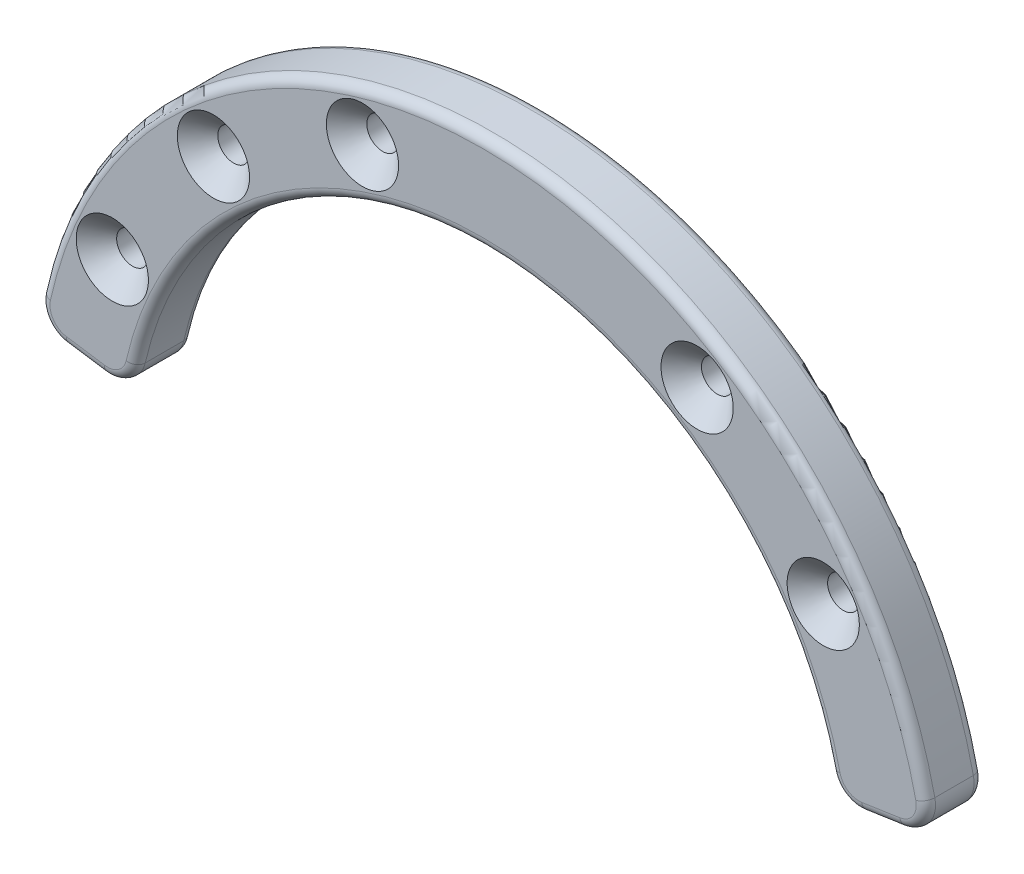
ISO-10303-21;
HEADER;
FILE_DESCRIPTION(('STEP AP214'),'2;1');
FILE_NAME('part.step','',(''),(''),'','','');
FILE_SCHEMA(('AUTOMOTIVE_DESIGN { 1 0 10303 214 1 1 1 1 }'));
ENDSEC;
DATA;
#1=APPLICATION_CONTEXT('core data for automotive mechanical design processes');
#2=APPLICATION_PROTOCOL_DEFINITION('international standard','automotive_design',2000,#1);
#3=PRODUCT_CONTEXT('',#1,'mechanical');
#4=PRODUCT('Part','Part','',(#3));
#5=PRODUCT_RELATED_PRODUCT_CATEGORY('part','',(#4));
#6=PRODUCT_DEFINITION_FORMATION('','',#4);
#7=PRODUCT_DEFINITION_CONTEXT('part definition',#1,'design');
#8=PRODUCT_DEFINITION('design','',#6,#7);
#9=PRODUCT_DEFINITION_SHAPE('','',#8);
#10=(LENGTH_UNIT() NAMED_UNIT(*) SI_UNIT(.MILLI.,.METRE.));
#11=(NAMED_UNIT(*) PLANE_ANGLE_UNIT() SI_UNIT($,.RADIAN.));
#12=(NAMED_UNIT(*) SI_UNIT($,.STERADIAN.) SOLID_ANGLE_UNIT());
#13=UNCERTAINTY_MEASURE_WITH_UNIT(LENGTH_MEASURE(1.E-05),#10,'distance_accuracy_value','');
#14=(GEOMETRIC_REPRESENTATION_CONTEXT(3) GLOBAL_UNCERTAINTY_ASSIGNED_CONTEXT((#13)) GLOBAL_UNIT_ASSIGNED_CONTEXT((#10,
#11,#12)) REPRESENTATION_CONTEXT('',''));
#15=CARTESIAN_POINT('',(0.,0.,0.));
#16=DIRECTION('',(0.,0.,1.));
#17=DIRECTION('',(1.,0.,0.));
#18=AXIS2_PLACEMENT_3D('',#15,#16,#17);
#19=CARTESIAN_POINT('',(0.,0.,6.));
#20=DIRECTION('',(0.,0.,-1.));
#21=DIRECTION('',(-1.,0.,0.));
#22=AXIS2_PLACEMENT_3D('',#19,#20,#21);
#23=CYLINDRICAL_SURFACE('',#22,47.);
#24=DIRECTION('',(0.,0.,-1.));
#25=VECTOR('',#24,1.);
#26=CARTESIAN_POINT('',(45.9019118426138,10.1002222348277,6.));
#27=LINE('',#26,#25);
#28=CARTESIAN_POINT('',(45.9019118426138,10.1002222348277,5.));
#29=VERTEX_POINT('',#28);
#30=CARTESIAN_POINT('',(45.9019118426138,10.1002222348277,1.));
#31=VERTEX_POINT('',#30);
#32=EDGE_CURVE('E353',#29,#31,#27,.T.);
#33=ORIENTED_EDGE('',*,*,#32,.T.);
#34=CARTESIAN_POINT('',(0.,0.,1.));
#35=DIRECTION('',(0.,0.,1.));
#36=DIRECTION('',(1.,0.,0.));
#37=AXIS2_PLACEMENT_3D('',#34,#35,#36);
#38=CIRCLE('',#37,47.);
#39=CARTESIAN_POINT('',(-45.9019118426138,10.1002222348277,1.));
#40=VERTEX_POINT('',#39);
#41=EDGE_CURVE('E237',#31,#40,#38,.T.);
#42=ORIENTED_EDGE('',*,*,#41,.T.);
#43=DIRECTION('',(0.,0.,-1.));
#44=VECTOR('',#43,1.);
#45=CARTESIAN_POINT('',(-45.9019118426138,10.1002222348277,6.));
#46=LINE('',#45,#44);
#47=CARTESIAN_POINT('',(-45.9019118426138,10.1002222348277,5.));
#48=VERTEX_POINT('',#47);
#49=EDGE_CURVE('E381',#40,#48,#46,.F.);
#50=ORIENTED_EDGE('',*,*,#49,.T.);
#51=CARTESIAN_POINT('',(0.,0.,5.));
#52=DIRECTION('',(0.,0.,1.));
#53=DIRECTION('',(1.,0.,0.));
#54=AXIS2_PLACEMENT_3D('',#51,#52,#53);
#55=CIRCLE('',#54,47.);
#56=EDGE_CURVE('E234',#48,#29,#55,.F.);
#57=ORIENTED_EDGE('',*,*,#56,.T.);
#58=EDGE_LOOP('',(#33,#42,#50,#57));
#59=FACE_BOUND('',#58,.T.);
#60=ADVANCED_FACE('F42',(#59),#23,.T.);
#61=CARTESIAN_POINT('',(-36.5935869443909,5.46894821179548,6.));
#62=DIRECTION('',(0.147809411129608,0.989015863361917,0.));
#63=DIRECTION('',(-0.989015863361917,0.147809411129608,0.));
#64=AXIS2_PLACEMENT_3D('',#61,#62,#63);
#65=PLANE('',#64);
#66=DIRECTION('',(0.,0.,-1.));
#67=VECTOR('',#66,1.);
#68=CARTESIAN_POINT('',(-43.4154308094528,6.48847960847636,6.));
#69=LINE('',#68,#67);
#70=CARTESIAN_POINT('',(-43.4154308094528,6.48847960847636,5.));
#71=VERTEX_POINT('',#70);
#72=CARTESIAN_POINT('',(-43.4154308094528,6.48847960847636,1.));
#73=VERTEX_POINT('',#72);
#74=EDGE_CURVE('E186',#71,#73,#69,.T.);
#75=ORIENTED_EDGE('',*,*,#74,.T.);
#76=DIRECTION('',(0.989015863361917,-0.147809411129608,0.));
#77=VECTOR('',#76,1.);
#78=CARTESIAN_POINT('',(-36.5935869443909,5.46894821179548,1.));
#79=LINE('',#78,#77);
#80=CARTESIAN_POINT('',(-39.4492133428361,5.8957244365221,1.));
#81=VERTEX_POINT('',#80);
#82=EDGE_CURVE('E225',#73,#81,#79,.T.);
#83=ORIENTED_EDGE('',*,*,#82,.T.);
#84=DIRECTION('',(0.,0.,-1.));
#85=VECTOR('',#84,1.);
#86=CARTESIAN_POINT('',(-39.4492133428361,5.8957244365221,6.));
#87=LINE('',#86,#85);
#88=CARTESIAN_POINT('',(-39.4492133428361,5.8957244365221,5.));
#89=VERTEX_POINT('',#88);
#90=EDGE_CURVE('E191',#81,#89,#87,.F.);
#91=ORIENTED_EDGE('',*,*,#90,.T.);
#92=DIRECTION('',(0.989015863361917,-0.147809411129608,0.));
#93=VECTOR('',#92,1.);
#94=CARTESIAN_POINT('',(-43.4154308094528,6.48847960847636,5.));
#95=LINE('',#94,#93);
#96=EDGE_CURVE('E222',#89,#71,#95,.F.);
#97=ORIENTED_EDGE('',*,*,#96,.T.);
#98=EDGE_LOOP('',(#75,#83,#91,#97));
#99=FACE_BOUND('',#98,.T.);
#100=ADVANCED_FACE('F459',(#99),#65,.F.);
#101=CARTESIAN_POINT('',(0.,0.,6.));
#102=DIRECTION('',(0.,0.,-1.));
#103=DIRECTION('',(-1.,0.,0.));
#104=AXIS2_PLACEMENT_3D('',#101,#102,#103);
#105=CYLINDRICAL_SURFACE('',#104,37.);
#106=DIRECTION('',(0.,0.,-1.));
#107=VECTOR('',#106,1.);
#108=CARTESIAN_POINT('',(-36.0803512262387,8.19806412461226,6.));
#109=LINE('',#108,#107);
#110=CARTESIAN_POINT('',(-36.0803512262387,8.19806412461226,5.));
#111=VERTEX_POINT('',#110);
#112=CARTESIAN_POINT('',(-36.0803512262387,8.19806412461226,1.));
#113=VERTEX_POINT('',#112);
#114=EDGE_CURVE('E366',#111,#113,#109,.T.);
#115=ORIENTED_EDGE('',*,*,#114,.T.);
#116=CARTESIAN_POINT('',(0.,0.,1.));
#117=DIRECTION('',(0.,0.,1.));
#118=DIRECTION('',(1.,0.,0.));
#119=AXIS2_PLACEMENT_3D('',#116,#117,#118);
#120=CIRCLE('',#119,37.);
#121=CARTESIAN_POINT('',(36.0803512262387,8.19806412461226,1.));
#122=VERTEX_POINT('',#121);
#123=EDGE_CURVE('E11',#113,#122,#120,.F.);
#124=ORIENTED_EDGE('',*,*,#123,.T.);
#125=DIRECTION('',(0.,0.,-1.));
#126=VECTOR('',#125,1.);
#127=CARTESIAN_POINT('',(36.0803512262387,8.19806412461226,6.));
#128=LINE('',#127,#126);
#129=CARTESIAN_POINT('',(36.0803512262387,8.19806412461226,5.));
#130=VERTEX_POINT('',#129);
#131=EDGE_CURVE('E377',#122,#130,#128,.F.);
#132=ORIENTED_EDGE('',*,*,#131,.T.);
#133=CARTESIAN_POINT('',(0.,0.,5.));
#134=DIRECTION('',(0.,0.,1.));
#135=DIRECTION('',(1.,0.,0.));
#136=AXIS2_PLACEMENT_3D('',#133,#134,#135);
#137=CIRCLE('',#136,37.);
#138=EDGE_CURVE('E52',#130,#111,#137,.T.);
#139=ORIENTED_EDGE('',*,*,#138,.T.);
#140=EDGE_LOOP('',(#115,#124,#132,#139));
#141=FACE_BOUND('',#140,.T.);
#142=ADVANCED_FACE('F465',(#141),#105,.F.);
#143=CARTESIAN_POINT('',(36.5935869443909,5.46894821179548,6.));
#144=DIRECTION('',(-0.147809411129608,0.989015863361917,0.));
#145=DIRECTION('',(-0.989015863361917,-0.147809411129608,0.));
#146=AXIS2_PLACEMENT_3D('',#143,#144,#145);
#147=PLANE('',#146);
#148=DIRECTION('',(0.,0.,-1.));
#149=VECTOR('',#148,1.);
#150=CARTESIAN_POINT('',(39.4492133428361,5.8957244365221,6.));
#151=LINE('',#150,#149);
#152=CARTESIAN_POINT('',(39.4492133428361,5.8957244365221,5.));
#153=VERTEX_POINT('',#152);
#154=CARTESIAN_POINT('',(39.4492133428361,5.8957244365221,1.));
#155=VERTEX_POINT('',#154);
#156=EDGE_CURVE('E360',#153,#155,#151,.T.);
#157=ORIENTED_EDGE('',*,*,#156,.T.);
#158=DIRECTION('',(0.989015863361917,0.147809411129608,0.));
#159=VECTOR('',#158,1.);
#160=CARTESIAN_POINT('',(36.5935869443909,5.46894821179548,1.));
#161=LINE('',#160,#159);
#162=CARTESIAN_POINT('',(43.4154308094528,6.48847960847636,1.));
#163=VERTEX_POINT('',#162);
#164=EDGE_CURVE('E249',#155,#163,#161,.T.);
#165=ORIENTED_EDGE('',*,*,#164,.T.);
#166=DIRECTION('',(0.,0.,-1.));
#167=VECTOR('',#166,1.);
#168=CARTESIAN_POINT('',(43.4154308094528,6.48847960847636,6.));
#169=LINE('',#168,#167);
#170=CARTESIAN_POINT('',(43.4154308094528,6.48847960847636,5.));
#171=VERTEX_POINT('',#170);
#172=EDGE_CURVE('E350',#163,#171,#169,.F.);
#173=ORIENTED_EDGE('',*,*,#172,.T.);
#174=DIRECTION('',(0.989015863361917,0.147809411129608,0.));
#175=VECTOR('',#174,1.);
#176=CARTESIAN_POINT('',(39.4492133428361,5.8957244365221,5.));
#177=LINE('',#176,#175);
#178=EDGE_CURVE('E246',#171,#153,#177,.F.);
#179=ORIENTED_EDGE('',*,*,#178,.T.);
#180=EDGE_LOOP('',(#157,#165,#173,#179));
#181=FACE_BOUND('',#180,.T.);
#182=ADVANCED_FACE('F356',(#181),#147,.F.);
#183=CARTESIAN_POINT('',(0.,0.,6.));
#184=DIRECTION('',(0.,0.,1.));
#185=DIRECTION('',(1.,0.,0.));
#186=AXIS2_PLACEMENT_3D('',#183,#184,#185);
#187=PLANE('',#186);
#188=DIRECTION('',(0.989015863361917,-0.147809411129608,0.));
#189=VECTOR('',#188,1.);
#190=CARTESIAN_POINT('',(-39.3014039317065,6.88474029988402,6.));
#191=LINE('',#190,#189);
#192=CARTESIAN_POINT('',(-43.2676213983232,7.47749547183828,6.));
#193=VERTEX_POINT('',#192);
#194=CARTESIAN_POINT('',(-39.3014039317065,6.88474029988402,6.));
#195=VERTEX_POINT('',#194);
#196=EDGE_CURVE('E60',#193,#195,#191,.T.);
#197=ORIENTED_EDGE('',*,*,#196,.T.);
#198=CARTESIAN_POINT('',(-39.0057851094473,8.86277202660785,6.));
#199=DIRECTION('',(0.,0.,1.));
#200=DIRECTION('',(1.,0.,0.));
#201=AXIS2_PLACEMENT_3D('',#198,#199,#200);
#202=CIRCLE('',#201,2.);
#203=CARTESIAN_POINT('',(-37.0554958539749,8.41963342527746,6.));
#204=VERTEX_POINT('',#203);
#205=EDGE_CURVE('E276',#195,#204,#202,.T.);
#206=ORIENTED_EDGE('',*,*,#205,.T.);
#207=CARTESIAN_POINT('',(0.,0.,6.));
#208=DIRECTION('',(0.,0.,1.));
#209=DIRECTION('',(1.,0.,0.));
#210=AXIS2_PLACEMENT_3D('',#207,#208,#209);
#211=CIRCLE('',#210,38.);
#212=CARTESIAN_POINT('',(37.0554958539749,8.41963342527746,6.));
#213=VERTEX_POINT('',#212);
#214=EDGE_CURVE('E257',#204,#213,#211,.F.);
#215=ORIENTED_EDGE('',*,*,#214,.T.);
#216=CARTESIAN_POINT('',(39.0057851094473,8.86277202660785,6.));
#217=DIRECTION('',(0.,0.,1.));
#218=DIRECTION('',(1.,0.,0.));
#219=AXIS2_PLACEMENT_3D('',#216,#217,#218);
#220=CIRCLE('',#219,2.);
#221=CARTESIAN_POINT('',(39.3014039317065,6.88474029988402,6.));
#222=VERTEX_POINT('',#221);
#223=EDGE_CURVE('E260',#213,#222,#220,.T.);
#224=ORIENTED_EDGE('',*,*,#223,.T.);
#225=DIRECTION('',(0.989015863361917,0.147809411129608,0.));
#226=VECTOR('',#225,1.);
#227=CARTESIAN_POINT('',(43.2676213983232,7.47749547183828,6.));
#228=LINE('',#227,#226);
#229=CARTESIAN_POINT('',(43.2676213983232,7.47749547183828,6.));
#230=VERTEX_POINT('',#229);
#231=EDGE_CURVE('E263',#222,#230,#228,.T.);
#232=ORIENTED_EDGE('',*,*,#231,.T.);
#233=CARTESIAN_POINT('',(42.972002576064,9.45552719856211,6.));
#234=DIRECTION('',(0.,0.,1.));
#235=DIRECTION('',(1.,0.,0.));
#236=AXIS2_PLACEMENT_3D('',#233,#234,#235);
#237=CIRCLE('',#236,2.);
#238=CARTESIAN_POINT('',(44.9252754204305,9.88532388940585,6.));
#239=VERTEX_POINT('',#238);
#240=EDGE_CURVE('E266',#230,#239,#237,.T.);
#241=ORIENTED_EDGE('',*,*,#240,.T.);
#242=CARTESIAN_POINT('',(0.,0.,6.));
#243=DIRECTION('',(0.,0.,1.));
#244=DIRECTION('',(1.,0.,0.));
#245=AXIS2_PLACEMENT_3D('',#242,#243,#244);
#246=CIRCLE('',#245,46.);
#247=CARTESIAN_POINT('',(-44.9252754204306,9.88532388940585,6.));
#248=VERTEX_POINT('',#247);
#249=EDGE_CURVE('E269',#239,#248,#246,.T.);
#250=ORIENTED_EDGE('',*,*,#249,.T.);
#251=CARTESIAN_POINT('',(-42.972002576064,9.45552719856211,6.));
#252=DIRECTION('',(0.,0.,1.));
#253=DIRECTION('',(1.,0.,0.));
#254=AXIS2_PLACEMENT_3D('',#251,#252,#253);
#255=CIRCLE('',#254,2.);
#256=EDGE_CURVE('E65',#248,#193,#255,.T.);
#257=ORIENTED_EDGE('',*,*,#256,.T.);
#258=EDGE_LOOP('',(#197,#206,#215,#224,#232,#241,#250,#257));
#259=FACE_BOUND('',#258,.T.);
#260=CARTESIAN_POINT('',(-38.4973377729861,16.7906202083129,6.));
#261=DIRECTION('',(0.,0.,1.));
#262=DIRECTION('',(1.,0.,0.));
#263=AXIS2_PLACEMENT_3D('',#260,#261,#262);
#264=CIRCLE('',#263,3.75);
#265=CARTESIAN_POINT('',(-34.7473377729861,16.7906202083129,6.));
#266=VERTEX_POINT('',#265);
#267=EDGE_CURVE('E303',#266,#266,#264,.T.);
#268=ORIENTED_EDGE('',*,*,#267,.F.);
#269=EDGE_LOOP('',(#268));
#270=FACE_BOUND('',#269,.T.);
#271=CARTESIAN_POINT('',(-27.9991090041942,31.3056560635971,6.));
#272=DIRECTION('',(0.,0.,1.));
#273=DIRECTION('',(1.,0.,0.));
#274=AXIS2_PLACEMENT_3D('',#271,#272,#273);
#275=CIRCLE('',#274,3.75);
#276=CARTESIAN_POINT('',(-24.2491090041942,31.3056560635971,6.));
#277=VERTEX_POINT('',#276);
#278=EDGE_CURVE('E414',#277,#277,#275,.T.);
#279=ORIENTED_EDGE('',*,*,#278,.F.);
#280=EDGE_LOOP('',(#279));
#281=FACE_BOUND('',#280,.T.);
#282=CARTESIAN_POINT('',(-12.5268724550049,40.0883668064767,6.));
#283=DIRECTION('',(0.,0.,1.));
#284=DIRECTION('',(1.,0.,0.));
#285=AXIS2_PLACEMENT_3D('',#282,#283,#284);
#286=CIRCLE('',#285,3.75);
#287=CARTESIAN_POINT('',(-8.77687245500494,40.0883668064767,6.));
#288=VERTEX_POINT('',#287);
#289=EDGE_CURVE('E404',#288,#288,#286,.T.);
#290=ORIENTED_EDGE('',*,*,#289,.F.);
#291=EDGE_LOOP('',(#290));
#292=FACE_BOUND('',#291,.T.);
#293=CARTESIAN_POINT('',(22.2221629793455,35.6390019624954,6.));
#294=DIRECTION('',(0.,0.,1.));
#295=DIRECTION('',(1.,0.,0.));
#296=AXIS2_PLACEMENT_3D('',#293,#294,#295);
#297=CIRCLE('',#296,3.75);
#298=CARTESIAN_POINT('',(25.9721629793455,35.6390019624954,6.));
#299=VERTEX_POINT('',#298);
#300=EDGE_CURVE('E399',#299,#299,#297,.T.);
#301=ORIENTED_EDGE('',*,*,#300,.F.);
#302=EDGE_LOOP('',(#301));
#303=FACE_BOUND('',#302,.T.);
#304=CARTESIAN_POINT('',(35.3163481039539,22.7309884807105,6.));
#305=DIRECTION('',(0.,0.,1.));
#306=DIRECTION('',(1.,0.,0.));
#307=AXIS2_PLACEMENT_3D('',#304,#305,#306);
#308=CIRCLE('',#307,3.75);
#309=CARTESIAN_POINT('',(39.0663481039539,22.7309884807105,6.));
#310=VERTEX_POINT('',#309);
#311=EDGE_CURVE('E394',#310,#310,#308,.T.);
#312=ORIENTED_EDGE('',*,*,#311,.F.);
#313=EDGE_LOOP('',(#312));
#314=FACE_BOUND('',#313,.T.);
#315=ADVANCED_FACE('F672',(#259,#270,#281,#292,#303,#314),#187,.T.);
#316=CARTESIAN_POINT('',(0.,0.,0.));
#317=DIRECTION('',(0.,0.,1.));
#318=DIRECTION('',(1.,0.,0.));
#319=AXIS2_PLACEMENT_3D('',#316,#317,#318);
#320=PLANE('',#319);
#321=CARTESIAN_POINT('',(0.,0.,0.));
#322=DIRECTION('',(0.,0.,1.));
#323=DIRECTION('',(1.,0.,0.));
#324=AXIS2_PLACEMENT_3D('',#321,#322,#323);
#325=CIRCLE('',#324,38.);
#326=CARTESIAN_POINT('',(37.0554958539749,8.41963342527746,0.));
#327=VERTEX_POINT('',#326);
#328=CARTESIAN_POINT('',(-37.0554958539749,8.41963342527746,0.));
#329=VERTEX_POINT('',#328);
#330=EDGE_CURVE('E162',#327,#329,#325,.T.);
#331=ORIENTED_EDGE('',*,*,#330,.T.);
#332=CARTESIAN_POINT('',(-39.0057851094473,8.86277202660785,0.));
#333=DIRECTION('',(0.,0.,1.));
#334=DIRECTION('',(1.,0.,0.));
#335=AXIS2_PLACEMENT_3D('',#332,#333,#334);
#336=CIRCLE('',#335,2.);
#337=CARTESIAN_POINT('',(-39.3014039317065,6.88474029988402,0.));
#338=VERTEX_POINT('',#337);
#339=EDGE_CURVE('E211',#329,#338,#336,.F.);
#340=ORIENTED_EDGE('',*,*,#339,.T.);
#341=DIRECTION('',(0.989015863361917,-0.147809411129608,0.));
#342=VECTOR('',#341,1.);
#343=CARTESIAN_POINT('',(0.147809411129607,0.989015863361916,0.));
#344=LINE('',#343,#342);
#345=CARTESIAN_POINT('',(-43.2676213983232,7.47749547183828,0.));
#346=VERTEX_POINT('',#345);
#347=EDGE_CURVE('E208',#338,#346,#344,.F.);
#348=ORIENTED_EDGE('',*,*,#347,.T.);
#349=CARTESIAN_POINT('',(-42.972002576064,9.45552719856211,0.));
#350=DIRECTION('',(0.,0.,1.));
#351=DIRECTION('',(1.,0.,0.));
#352=AXIS2_PLACEMENT_3D('',#349,#350,#351);
#353=CIRCLE('',#352,2.);
#354=CARTESIAN_POINT('',(-44.9252754204306,9.88532388940585,0.));
#355=VERTEX_POINT('',#354);
#356=EDGE_CURVE('E205',#346,#355,#353,.F.);
#357=ORIENTED_EDGE('',*,*,#356,.T.);
#358=CARTESIAN_POINT('',(0.,0.,0.));
#359=DIRECTION('',(0.,0.,1.));
#360=DIRECTION('',(1.,0.,0.));
#361=AXIS2_PLACEMENT_3D('',#358,#359,#360);
#362=CIRCLE('',#361,46.);
#363=CARTESIAN_POINT('',(44.9252754204305,9.88532388940585,0.));
#364=VERTEX_POINT('',#363);
#365=EDGE_CURVE('E202',#355,#364,#362,.F.);
#366=ORIENTED_EDGE('',*,*,#365,.T.);
#367=CARTESIAN_POINT('',(42.972002576064,9.45552719856211,0.));
#368=DIRECTION('',(0.,0.,1.));
#369=DIRECTION('',(1.,0.,0.));
#370=AXIS2_PLACEMENT_3D('',#367,#368,#369);
#371=CIRCLE('',#370,2.);
#372=CARTESIAN_POINT('',(43.2676213983232,7.47749547183828,0.));
#373=VERTEX_POINT('',#372);
#374=EDGE_CURVE('E199',#364,#373,#371,.F.);
#375=ORIENTED_EDGE('',*,*,#374,.T.);
#376=DIRECTION('',(0.989015863361917,0.147809411129608,0.));
#377=VECTOR('',#376,1.);
#378=CARTESIAN_POINT('',(-0.147809411129607,0.989015863361915,0.));
#379=LINE('',#378,#377);
#380=CARTESIAN_POINT('',(39.3014039317065,6.88474029988402,0.));
#381=VERTEX_POINT('',#380);
#382=EDGE_CURVE('E165',#373,#381,#379,.F.);
#383=ORIENTED_EDGE('',*,*,#382,.T.);
#384=CARTESIAN_POINT('',(39.0057851094473,8.86277202660785,0.));
#385=DIRECTION('',(0.,0.,1.));
#386=DIRECTION('',(1.,0.,0.));
#387=AXIS2_PLACEMENT_3D('',#384,#385,#386);
#388=CIRCLE('',#387,2.);
#389=EDGE_CURVE('E156',#381,#327,#388,.F.);
#390=ORIENTED_EDGE('',*,*,#389,.T.);
#391=EDGE_LOOP('',(#331,#340,#348,#357,#366,#375,#383,#390));
#392=FACE_BOUND('',#391,.T.);
#393=CARTESIAN_POINT('',(-38.4973377729861,16.7906202083129,0.));
#394=DIRECTION('',(0.,0.,1.));
#395=DIRECTION('',(1.,0.,0.));
#396=AXIS2_PLACEMENT_3D('',#393,#394,#395);
#397=CIRCLE('',#396,1.65);
#398=CARTESIAN_POINT('',(-36.8473377729861,16.7906202083129,0.));
#399=VERTEX_POINT('',#398);
#400=EDGE_CURVE('E194',#399,#399,#397,.T.);
#401=ORIENTED_EDGE('',*,*,#400,.T.);
#402=EDGE_LOOP('',(#401));
#403=FACE_BOUND('',#402,.T.);
#404=CARTESIAN_POINT('',(-27.9991090041942,31.3056560635971,0.));
#405=DIRECTION('',(0.,0.,1.));
#406=DIRECTION('',(1.,0.,0.));
#407=AXIS2_PLACEMENT_3D('',#404,#405,#406);
#408=CIRCLE('',#407,1.65);
#409=CARTESIAN_POINT('',(-26.3491090041942,31.3056560635971,0.));
#410=VERTEX_POINT('',#409);
#411=EDGE_CURVE('E401',#410,#410,#408,.T.);
#412=ORIENTED_EDGE('',*,*,#411,.T.);
#413=EDGE_LOOP('',(#412));
#414=FACE_BOUND('',#413,.T.);
#415=CARTESIAN_POINT('',(-12.5268724550049,40.0883668064767,0.));
#416=DIRECTION('',(0.,0.,1.));
#417=DIRECTION('',(1.,0.,0.));
#418=AXIS2_PLACEMENT_3D('',#415,#416,#417);
#419=CIRCLE('',#418,1.65);
#420=CARTESIAN_POINT('',(-10.8768724550049,40.0883668064767,0.));
#421=VERTEX_POINT('',#420);
#422=EDGE_CURVE('E396',#421,#421,#419,.T.);
#423=ORIENTED_EDGE('',*,*,#422,.T.);
#424=EDGE_LOOP('',(#423));
#425=FACE_BOUND('',#424,.T.);
#426=CARTESIAN_POINT('',(22.2221629793455,35.6390019624954,0.));
#427=DIRECTION('',(0.,0.,1.));
#428=DIRECTION('',(1.,0.,0.));
#429=AXIS2_PLACEMENT_3D('',#426,#427,#428);
#430=CIRCLE('',#429,1.65);
#431=CARTESIAN_POINT('',(23.8721629793455,35.6390019624954,0.));
#432=VERTEX_POINT('',#431);
#433=EDGE_CURVE('E390',#432,#432,#430,.T.);
#434=ORIENTED_EDGE('',*,*,#433,.T.);
#435=EDGE_LOOP('',(#434));
#436=FACE_BOUND('',#435,.T.);
#437=CARTESIAN_POINT('',(35.3163481039539,22.7309884807105,0.));
#438=DIRECTION('',(0.,0.,1.));
#439=DIRECTION('',(1.,0.,0.));
#440=AXIS2_PLACEMENT_3D('',#437,#438,#439);
#441=CIRCLE('',#440,1.65);
#442=CARTESIAN_POINT('',(36.9663481039539,22.7309884807105,0.));
#443=VERTEX_POINT('',#442);
#444=EDGE_CURVE('E361',#443,#443,#441,.T.);
#445=ORIENTED_EDGE('',*,*,#444,.T.);
#446=EDGE_LOOP('',(#445));
#447=FACE_BOUND('',#446,.T.);
#448=ADVANCED_FACE('F158',(#392,#403,#414,#425,#436,#447),#320,.F.);
#449=CARTESIAN_POINT('',(39.0057851094473,8.86277202660785,6.));
#450=DIRECTION('',(0.,0.,-1.));
#451=DIRECTION('',(-1.,0.,0.));
#452=AXIS2_PLACEMENT_3D('',#449,#450,#451);
#453=CYLINDRICAL_SURFACE('',#452,3.);
#454=ORIENTED_EDGE('',*,*,#131,.F.);
#455=CARTESIAN_POINT('',(39.0057851094473,8.86277202660785,1.));
#456=DIRECTION('',(0.,0.,1.));
#457=DIRECTION('',(1.,0.,0.));
#458=AXIS2_PLACEMENT_3D('',#455,#456,#457);
#459=CIRCLE('',#458,3.);
#460=EDGE_CURVE('E175',#122,#155,#459,.T.);
#461=ORIENTED_EDGE('',*,*,#460,.T.);
#462=ORIENTED_EDGE('',*,*,#156,.F.);
#463=CARTESIAN_POINT('',(39.0057851094473,8.86277202660785,5.));
#464=DIRECTION('',(0.,0.,1.));
#465=DIRECTION('',(1.,0.,0.));
#466=AXIS2_PLACEMENT_3D('',#463,#464,#465);
#467=CIRCLE('',#466,3.);
#468=EDGE_CURVE('E252',#153,#130,#467,.F.);
#469=ORIENTED_EDGE('',*,*,#468,.T.);
#470=EDGE_LOOP('',(#454,#461,#462,#469));
#471=FACE_BOUND('',#470,.T.);
#472=ADVANCED_FACE('F470',(#471),#453,.T.);
#473=CARTESIAN_POINT('',(42.972002576064,9.45552719856211,6.));
#474=DIRECTION('',(0.,0.,-1.));
#475=DIRECTION('',(-1.,0.,0.));
#476=AXIS2_PLACEMENT_3D('',#473,#474,#475);
#477=CYLINDRICAL_SURFACE('',#476,3.);
#478=ORIENTED_EDGE('',*,*,#172,.F.);
#479=CARTESIAN_POINT('',(42.972002576064,9.45552719856211,1.));
#480=DIRECTION('',(0.,0.,1.));
#481=DIRECTION('',(1.,0.,0.));
#482=AXIS2_PLACEMENT_3D('',#479,#480,#481);
#483=CIRCLE('',#482,3.);
#484=EDGE_CURVE('E243',#163,#31,#483,.T.);
#485=ORIENTED_EDGE('',*,*,#484,.T.);
#486=ORIENTED_EDGE('',*,*,#32,.F.);
#487=CARTESIAN_POINT('',(42.972002576064,9.45552719856211,5.));
#488=DIRECTION('',(0.,0.,1.));
#489=DIRECTION('',(1.,0.,0.));
#490=AXIS2_PLACEMENT_3D('',#487,#488,#489);
#491=CIRCLE('',#490,3.);
#492=EDGE_CURVE('E240',#29,#171,#491,.F.);
#493=ORIENTED_EDGE('',*,*,#492,.T.);
#494=EDGE_LOOP('',(#478,#485,#486,#493));
#495=FACE_BOUND('',#494,.T.);
#496=ADVANCED_FACE('F349',(#495),#477,.T.);
#497=CARTESIAN_POINT('',(-42.972002576064,9.45552719856211,6.));
#498=DIRECTION('',(0.,0.,-1.));
#499=DIRECTION('',(-1.,0.,0.));
#500=AXIS2_PLACEMENT_3D('',#497,#498,#499);
#501=CYLINDRICAL_SURFACE('',#500,3.);
#502=ORIENTED_EDGE('',*,*,#49,.F.);
#503=CARTESIAN_POINT('',(-42.972002576064,9.45552719856211,1.));
#504=DIRECTION('',(0.,0.,1.));
#505=DIRECTION('',(1.,0.,0.));
#506=AXIS2_PLACEMENT_3D('',#503,#504,#505);
#507=CIRCLE('',#506,3.);
#508=EDGE_CURVE('E231',#40,#73,#507,.T.);
#509=ORIENTED_EDGE('',*,*,#508,.T.);
#510=ORIENTED_EDGE('',*,*,#74,.F.);
#511=CARTESIAN_POINT('',(-42.972002576064,9.45552719856211,5.));
#512=DIRECTION('',(0.,0.,1.));
#513=DIRECTION('',(1.,0.,0.));
#514=AXIS2_PLACEMENT_3D('',#511,#512,#513);
#515=CIRCLE('',#514,3.);
#516=EDGE_CURVE('E228',#71,#48,#515,.F.);
#517=ORIENTED_EDGE('',*,*,#516,.T.);
#518=EDGE_LOOP('',(#502,#509,#510,#517));
#519=FACE_BOUND('',#518,.T.);
#520=ADVANCED_FACE('F476',(#519),#501,.T.);
#521=CARTESIAN_POINT('',(-39.0057851094473,8.86277202660785,6.));
#522=DIRECTION('',(0.,0.,-1.));
#523=DIRECTION('',(-1.,0.,0.));
#524=AXIS2_PLACEMENT_3D('',#521,#522,#523);
#525=CYLINDRICAL_SURFACE('',#524,3.);
#526=ORIENTED_EDGE('',*,*,#90,.F.);
#527=CARTESIAN_POINT('',(-39.0057851094473,8.86277202660785,1.));
#528=DIRECTION('',(0.,0.,1.));
#529=DIRECTION('',(1.,0.,0.));
#530=AXIS2_PLACEMENT_3D('',#527,#528,#529);
#531=CIRCLE('',#530,3.);
#532=EDGE_CURVE('E218',#81,#113,#531,.T.);
#533=ORIENTED_EDGE('',*,*,#532,.T.);
#534=ORIENTED_EDGE('',*,*,#114,.F.);
#535=CARTESIAN_POINT('',(-39.0057851094473,8.86277202660785,5.));
#536=DIRECTION('',(0.,0.,1.));
#537=DIRECTION('',(1.,0.,0.));
#538=AXIS2_PLACEMENT_3D('',#535,#536,#537);
#539=CIRCLE('',#538,3.);
#540=EDGE_CURVE('E214',#111,#89,#539,.F.);
#541=ORIENTED_EDGE('',*,*,#540,.T.);
#542=EDGE_LOOP('',(#526,#533,#534,#541));
#543=FACE_BOUND('',#542,.T.);
#544=ADVANCED_FACE('F456',(#543),#525,.T.);
#545=CARTESIAN_POINT('',(35.3163481039539,22.7309884807105,6.));
#546=DIRECTION('',(0.,0.,1.));
#547=DIRECTION('',(1.,0.,0.));
#548=AXIS2_PLACEMENT_3D('',#545,#546,#547);
#549=CYLINDRICAL_SURFACE('',#548,1.65);
#550=CARTESIAN_POINT('',(35.3163481039539,22.7309884807105,3.9));
#551=DIRECTION('',(0.,0.,1.));
#552=DIRECTION('',(1.,0.,0.));
#553=AXIS2_PLACEMENT_3D('',#550,#551,#552);
#554=CIRCLE('',#553,1.65);
#555=CARTESIAN_POINT('',(36.9663481039539,22.7309884807105,3.9));
#556=VERTEX_POINT('',#555);
#557=EDGE_CURVE('E369',#556,#556,#554,.T.);
#558=ORIENTED_EDGE('',*,*,#557,.T.);
#559=EDGE_LOOP('',(#558));
#560=FACE_BOUND('',#559,.T.);
#561=ORIENTED_EDGE('',*,*,#444,.F.);
#562=EDGE_LOOP('',(#561));
#563=FACE_BOUND('',#562,.T.);
#564=ADVANCED_FACE('F442',(#560,#563),#549,.F.);
#565=CARTESIAN_POINT('',(35.3163481039539,22.7309884807105,6.));
#566=DIRECTION('',(0.,0.,1.));
#567=DIRECTION('',(1.,0.,0.));
#568=AXIS2_PLACEMENT_3D('',#565,#566,#567);
#569=CONICAL_SURFACE('',#568,3.75,0.785398163397449);
#570=ORIENTED_EDGE('',*,*,#557,.F.);
#571=EDGE_LOOP('',(#570));
#572=FACE_BOUND('',#571,.T.);
#573=ORIENTED_EDGE('',*,*,#311,.T.);
#574=EDGE_LOOP('',(#573));
#575=FACE_BOUND('',#574,.T.);
#576=ADVANCED_FACE('F445',(#572,#575),#569,.F.);
#577=CARTESIAN_POINT('',(22.2221629793455,35.6390019624954,6.));
#578=DIRECTION('',(0.,0.,1.));
#579=DIRECTION('',(1.,0.,0.));
#580=AXIS2_PLACEMENT_3D('',#577,#578,#579);
#581=CYLINDRICAL_SURFACE('',#580,1.65);
#582=CARTESIAN_POINT('',(22.2221629793455,35.6390019624954,3.9));
#583=DIRECTION('',(0.,0.,1.));
#584=DIRECTION('',(1.,0.,0.));
#585=AXIS2_PLACEMENT_3D('',#582,#583,#584);
#586=CIRCLE('',#585,1.65);
#587=CARTESIAN_POINT('',(23.8721629793455,35.6390019624954,3.9));
#588=VERTEX_POINT('',#587);
#589=EDGE_CURVE('E395',#588,#588,#586,.T.);
#590=ORIENTED_EDGE('',*,*,#589,.T.);
#591=EDGE_LOOP('',(#590));
#592=FACE_BOUND('',#591,.T.);
#593=ORIENTED_EDGE('',*,*,#433,.F.);
#594=EDGE_LOOP('',(#593));
#595=FACE_BOUND('',#594,.T.);
#596=ADVANCED_FACE('F447',(#592,#595),#581,.F.);
#597=CARTESIAN_POINT('',(22.2221629793455,35.6390019624954,6.));
#598=DIRECTION('',(0.,0.,1.));
#599=DIRECTION('',(1.,0.,0.));
#600=AXIS2_PLACEMENT_3D('',#597,#598,#599);
#601=CONICAL_SURFACE('',#600,3.75,0.785398163397448);
#602=ORIENTED_EDGE('',*,*,#589,.F.);
#603=EDGE_LOOP('',(#602));
#604=FACE_BOUND('',#603,.T.);
#605=ORIENTED_EDGE('',*,*,#300,.T.);
#606=EDGE_LOOP('',(#605));
#607=FACE_BOUND('',#606,.T.);
#608=ADVANCED_FACE('F453',(#604,#607),#601,.F.);
#609=CARTESIAN_POINT('',(-12.5268724550049,40.0883668064767,6.));
#610=DIRECTION('',(0.,0.,1.));
#611=DIRECTION('',(1.,0.,0.));
#612=AXIS2_PLACEMENT_3D('',#609,#610,#611);
#613=CYLINDRICAL_SURFACE('',#612,1.65);
#614=CARTESIAN_POINT('',(-12.5268724550049,40.0883668064767,3.9));
#615=DIRECTION('',(0.,0.,1.));
#616=DIRECTION('',(1.,0.,0.));
#617=AXIS2_PLACEMENT_3D('',#614,#615,#616);
#618=CIRCLE('',#617,1.65);
#619=CARTESIAN_POINT('',(-10.8768724550049,40.0883668064767,3.9));
#620=VERTEX_POINT('',#619);
#621=EDGE_CURVE('E400',#620,#620,#618,.T.);
#622=ORIENTED_EDGE('',*,*,#621,.T.);
#623=EDGE_LOOP('',(#622));
#624=FACE_BOUND('',#623,.T.);
#625=ORIENTED_EDGE('',*,*,#422,.F.);
#626=EDGE_LOOP('',(#625));
#627=FACE_BOUND('',#626,.T.);
#628=ADVANCED_FACE('F609',(#624,#627),#613,.F.);
#629=CARTESIAN_POINT('',(-12.5268724550049,40.0883668064767,6.));
#630=DIRECTION('',(0.,0.,1.));
#631=DIRECTION('',(1.,0.,0.));
#632=AXIS2_PLACEMENT_3D('',#629,#630,#631);
#633=CONICAL_SURFACE('',#632,3.75,0.785398163397448);
#634=ORIENTED_EDGE('',*,*,#621,.F.);
#635=EDGE_LOOP('',(#634));
#636=FACE_BOUND('',#635,.T.);
#637=ORIENTED_EDGE('',*,*,#289,.T.);
#638=EDGE_LOOP('',(#637));
#639=FACE_BOUND('',#638,.T.);
#640=ADVANCED_FACE('F602',(#636,#639),#633,.F.);
#641=CARTESIAN_POINT('',(-27.9991090041942,31.3056560635971,6.));
#642=DIRECTION('',(0.,0.,1.));
#643=DIRECTION('',(1.,0.,0.));
#644=AXIS2_PLACEMENT_3D('',#641,#642,#643);
#645=CYLINDRICAL_SURFACE('',#644,1.65);
#646=CARTESIAN_POINT('',(-27.9991090041942,31.3056560635971,3.9));
#647=DIRECTION('',(0.,0.,1.));
#648=DIRECTION('',(1.,0.,0.));
#649=AXIS2_PLACEMENT_3D('',#646,#647,#648);
#650=CIRCLE('',#649,1.65);
#651=CARTESIAN_POINT('',(-26.3491090041942,31.3056560635971,3.9));
#652=VERTEX_POINT('',#651);
#653=EDGE_CURVE('E405',#652,#652,#650,.T.);
#654=ORIENTED_EDGE('',*,*,#653,.T.);
#655=EDGE_LOOP('',(#654));
#656=FACE_BOUND('',#655,.T.);
#657=ORIENTED_EDGE('',*,*,#411,.F.);
#658=EDGE_LOOP('',(#657));
#659=FACE_BOUND('',#658,.T.);
#660=ADVANCED_FACE('F594',(#656,#659),#645,.F.);
#661=CARTESIAN_POINT('',(-27.9991090041942,31.3056560635971,6.));
#662=DIRECTION('',(0.,0.,1.));
#663=DIRECTION('',(1.,0.,0.));
#664=AXIS2_PLACEMENT_3D('',#661,#662,#663);
#665=CONICAL_SURFACE('',#664,3.75,0.785398163397448);
#666=ORIENTED_EDGE('',*,*,#653,.F.);
#667=EDGE_LOOP('',(#666));
#668=FACE_BOUND('',#667,.T.);
#669=ORIENTED_EDGE('',*,*,#278,.T.);
#670=EDGE_LOOP('',(#669));
#671=FACE_BOUND('',#670,.T.);
#672=ADVANCED_FACE('F586',(#668,#671),#665,.F.);
#673=CARTESIAN_POINT('',(-38.4973377729861,16.7906202083129,6.));
#674=DIRECTION('',(0.,0.,1.));
#675=DIRECTION('',(1.,0.,0.));
#676=AXIS2_PLACEMENT_3D('',#673,#674,#675);
#677=CYLINDRICAL_SURFACE('',#676,1.65);
#678=CARTESIAN_POINT('',(-38.4973377729861,16.7906202083129,3.9));
#679=DIRECTION('',(0.,0.,1.));
#680=DIRECTION('',(1.,0.,0.));
#681=AXIS2_PLACEMENT_3D('',#678,#679,#680);
#682=CIRCLE('',#681,1.65);
#683=CARTESIAN_POINT('',(-36.8473377729861,16.7906202083129,3.9));
#684=VERTEX_POINT('',#683);
#685=EDGE_CURVE('E897',#684,#684,#682,.T.);
#686=ORIENTED_EDGE('',*,*,#685,.T.);
#687=EDGE_LOOP('',(#686));
#688=FACE_BOUND('',#687,.T.);
#689=ORIENTED_EDGE('',*,*,#400,.F.);
#690=EDGE_LOOP('',(#689));
#691=FACE_BOUND('',#690,.T.);
#692=ADVANCED_FACE('F578',(#688,#691),#677,.F.);
#693=CARTESIAN_POINT('',(-38.4973377729861,16.7906202083129,6.));
#694=DIRECTION('',(0.,0.,1.));
#695=DIRECTION('',(1.,0.,0.));
#696=AXIS2_PLACEMENT_3D('',#693,#694,#695);
#697=CONICAL_SURFACE('',#696,3.75,0.785398163397447);
#698=ORIENTED_EDGE('',*,*,#685,.F.);
#699=EDGE_LOOP('',(#698));
#700=FACE_BOUND('',#699,.T.);
#701=ORIENTED_EDGE('',*,*,#267,.T.);
#702=EDGE_LOOP('',(#701));
#703=FACE_BOUND('',#702,.T.);
#704=ADVANCED_FACE('F510',(#700,#703),#697,.F.);
#705=CARTESIAN_POINT('',(42.972002576064,9.45552719856211,1.));
#706=DIRECTION('',(0.,0.,1.));
#707=DIRECTION('',(1.,0.,0.));
#708=AXIS2_PLACEMENT_3D('',#705,#706,#707);
#709=TOROIDAL_SURFACE('',#708,2.,1.);
#710=CARTESIAN_POINT('',(44.9252754204305,9.88532388940585,1.));
#711=DIRECTION('',(-0.214898345421867,0.976636422183273,0.));
#712=DIRECTION('',(-0.976636422183273,-0.214898345421867,0.));
#713=AXIS2_PLACEMENT_3D('',#710,#711,#712);
#714=CIRCLE('',#713,1.);
#715=EDGE_CURVE('E295',#31,#364,#714,.T.);
#716=ORIENTED_EDGE('',*,*,#715,.F.);
#717=ORIENTED_EDGE('',*,*,#484,.F.);
#718=CARTESIAN_POINT('',(43.2676213983232,7.47749547183828,1.));
#719=DIRECTION('',(-0.989015863361917,-0.147809411129608,0.));
#720=DIRECTION('',(0.147809411129608,-0.989015863361917,0.));
#721=AXIS2_PLACEMENT_3D('',#718,#719,#720);
#722=CIRCLE('',#721,1.);
#723=EDGE_CURVE('E299',#373,#163,#722,.T.);
#724=ORIENTED_EDGE('',*,*,#723,.F.);
#725=ORIENTED_EDGE('',*,*,#374,.F.);
#726=EDGE_LOOP('',(#716,#717,#724,#725));
#727=FACE_BOUND('',#726,.T.);
#728=ADVANCED_FACE('F506',(#727),#709,.T.);
#729=CARTESIAN_POINT('',(36.4457775332613,6.4579640751574,1.));
#730=DIRECTION('',(0.989015863361917,0.147809411129608,0.));
#731=DIRECTION('',(-0.147809411129608,0.989015863361917,0.));
#732=AXIS2_PLACEMENT_3D('',#729,#730,#731);
#733=CYLINDRICAL_SURFACE('',#732,1.);
#734=ORIENTED_EDGE('',*,*,#723,.T.);
#735=ORIENTED_EDGE('',*,*,#164,.F.);
#736=CARTESIAN_POINT('',(39.3014039317065,6.88474029988402,1.));
#737=DIRECTION('',(-0.989015863361917,-0.147809411129608,0.));
#738=DIRECTION('',(0.147809411129608,-0.989015863361917,0.));
#739=AXIS2_PLACEMENT_3D('',#736,#737,#738);
#740=CIRCLE('',#739,1.);
#741=EDGE_CURVE('E292',#381,#155,#740,.T.);
#742=ORIENTED_EDGE('',*,*,#741,.F.);
#743=ORIENTED_EDGE('',*,*,#382,.F.);
#744=EDGE_LOOP('',(#734,#735,#742,#743));
#745=FACE_BOUND('',#744,.T.);
#746=ADVANCED_FACE('F502',(#745),#733,.T.);
#747=CARTESIAN_POINT('',(0.,0.,1.));
#748=DIRECTION('',(0.,0.,1.));
#749=DIRECTION('',(1.,0.,0.));
#750=AXIS2_PLACEMENT_3D('',#747,#748,#749);
#751=TOROIDAL_SURFACE('',#750,46.,1.);
#752=ORIENTED_EDGE('',*,*,#715,.T.);
#753=ORIENTED_EDGE('',*,*,#365,.F.);
#754=CARTESIAN_POINT('',(-44.9252754204306,9.88532388940585,1.));
#755=DIRECTION('',(-0.214898345421867,-0.976636422183273,0.));
#756=DIRECTION('',(0.976636422183273,-0.214898345421867,0.));
#757=AXIS2_PLACEMENT_3D('',#754,#755,#756);
#758=CIRCLE('',#757,1.);
#759=EDGE_CURVE('E179',#40,#355,#758,.T.);
#760=ORIENTED_EDGE('',*,*,#759,.F.);
#761=ORIENTED_EDGE('',*,*,#41,.F.);
#762=EDGE_LOOP('',(#752,#753,#760,#761));
#763=FACE_BOUND('',#762,.T.);
#764=ADVANCED_FACE('F499',(#763),#751,.T.);
#765=CARTESIAN_POINT('',(39.0057851094473,8.86277202660785,1.));
#766=DIRECTION('',(0.,0.,1.));
#767=DIRECTION('',(1.,0.,0.));
#768=AXIS2_PLACEMENT_3D('',#765,#766,#767);
#769=TOROIDAL_SURFACE('',#768,2.,1.);
#770=ORIENTED_EDGE('',*,*,#741,.T.);
#771=ORIENTED_EDGE('',*,*,#460,.F.);
#772=CARTESIAN_POINT('',(37.0554958539749,8.41963342527746,1.));
#773=DIRECTION('',(-0.221569300665198,0.975144627736181,0.));
#774=DIRECTION('',(-0.975144627736181,-0.221569300665198,0.));
#775=AXIS2_PLACEMENT_3D('',#772,#773,#774);
#776=CIRCLE('',#775,1.);
#777=EDGE_CURVE('E173',#327,#122,#776,.T.);
#778=ORIENTED_EDGE('',*,*,#777,.F.);
#779=ORIENTED_EDGE('',*,*,#389,.F.);
#780=EDGE_LOOP('',(#770,#771,#778,#779));
#781=FACE_BOUND('',#780,.T.);
#782=ADVANCED_FACE('F174',(#781),#769,.T.);
#783=CARTESIAN_POINT('',(-42.972002576064,9.45552719856211,1.));
#784=DIRECTION('',(0.,0.,1.));
#785=DIRECTION('',(1.,0.,0.));
#786=AXIS2_PLACEMENT_3D('',#783,#784,#785);
#787=TOROIDAL_SURFACE('',#786,2.,1.);
#788=ORIENTED_EDGE('',*,*,#759,.T.);
#789=ORIENTED_EDGE('',*,*,#356,.F.);
#790=CARTESIAN_POINT('',(-43.2676213983232,7.47749547183828,1.));
#791=DIRECTION('',(0.989015863361917,-0.147809411129608,0.));
#792=DIRECTION('',(0.147809411129608,0.989015863361917,0.));
#793=AXIS2_PLACEMENT_3D('',#790,#791,#792);
#794=CIRCLE('',#793,1.);
#795=EDGE_CURVE('E180',#73,#346,#794,.T.);
#796=ORIENTED_EDGE('',*,*,#795,.F.);
#797=ORIENTED_EDGE('',*,*,#508,.F.);
#798=EDGE_LOOP('',(#788,#789,#796,#797));
#799=FACE_BOUND('',#798,.T.);
#800=ADVANCED_FACE('F493',(#799),#787,.T.);
#801=CARTESIAN_POINT('',(0.,0.,1.));
#802=DIRECTION('',(0.,0.,1.));
#803=DIRECTION('',(1.,0.,0.));
#804=AXIS2_PLACEMENT_3D('',#801,#802,#803);
#805=TOROIDAL_SURFACE('',#804,38.,1.);
#806=ORIENTED_EDGE('',*,*,#777,.T.);
#807=ORIENTED_EDGE('',*,*,#123,.F.);
#808=CARTESIAN_POINT('',(-37.0554958539749,8.41963342527746,1.));
#809=DIRECTION('',(-0.221569300665198,-0.975144627736181,0.));
#810=DIRECTION('',(0.975144627736181,-0.221569300665198,0.));
#811=AXIS2_PLACEMENT_3D('',#808,#809,#810);
#812=CIRCLE('',#811,1.);
#813=EDGE_CURVE('E183',#329,#113,#812,.T.);
#814=ORIENTED_EDGE('',*,*,#813,.F.);
#815=ORIENTED_EDGE('',*,*,#330,.F.);
#816=EDGE_LOOP('',(#806,#807,#814,#815));
#817=FACE_BOUND('',#816,.T.);
#818=ADVANCED_FACE('F182',(#817),#805,.T.);
#819=CARTESIAN_POINT('',(-36.4457775332613,6.4579640751574,1.));
#820=DIRECTION('',(0.989015863361917,-0.147809411129608,0.));
#821=DIRECTION('',(0.147809411129608,0.989015863361917,0.));
#822=AXIS2_PLACEMENT_3D('',#819,#820,#821);
#823=CYLINDRICAL_SURFACE('',#822,1.);
#824=ORIENTED_EDGE('',*,*,#795,.T.);
#825=ORIENTED_EDGE('',*,*,#347,.F.);
#826=CARTESIAN_POINT('',(-39.3014039317065,6.88474029988402,1.));
#827=DIRECTION('',(0.989015863361917,-0.147809411129608,0.));
#828=DIRECTION('',(0.147809411129608,0.989015863361917,0.));
#829=AXIS2_PLACEMENT_3D('',#826,#827,#828);
#830=CIRCLE('',#829,1.);
#831=EDGE_CURVE('E281',#81,#338,#830,.T.);
#832=ORIENTED_EDGE('',*,*,#831,.F.);
#833=ORIENTED_EDGE('',*,*,#82,.F.);
#834=EDGE_LOOP('',(#824,#825,#832,#833));
#835=FACE_BOUND('',#834,.T.);
#836=ADVANCED_FACE('F486',(#835),#823,.T.);
#837=CARTESIAN_POINT('',(-39.0057851094473,8.86277202660785,1.));
#838=DIRECTION('',(0.,0.,1.));
#839=DIRECTION('',(1.,0.,0.));
#840=AXIS2_PLACEMENT_3D('',#837,#838,#839);
#841=TOROIDAL_SURFACE('',#840,2.,1.);
#842=ORIENTED_EDGE('',*,*,#813,.T.);
#843=ORIENTED_EDGE('',*,*,#532,.F.);
#844=ORIENTED_EDGE('',*,*,#831,.T.);
#845=ORIENTED_EDGE('',*,*,#339,.F.);
#846=EDGE_LOOP('',(#842,#843,#844,#845));
#847=FACE_BOUND('',#846,.T.);
#848=ADVANCED_FACE('F483',(#847),#841,.T.);
#849=CARTESIAN_POINT('',(42.972002576064,9.45552719856211,5.));
#850=DIRECTION('',(0.,0.,1.));
#851=DIRECTION('',(1.,0.,0.));
#852=AXIS2_PLACEMENT_3D('',#849,#850,#851);
#853=TOROIDAL_SURFACE('',#852,2.,1.);
#854=CARTESIAN_POINT('',(43.2676213983232,7.47749547183828,5.));
#855=DIRECTION('',(-0.989015863361917,-0.147809411129608,0.));
#856=DIRECTION('',(0.147809411129608,-0.989015863361917,0.));
#857=AXIS2_PLACEMENT_3D('',#854,#855,#856);
#858=CIRCLE('',#857,1.);
#859=EDGE_CURVE('E325',#171,#230,#858,.T.);
#860=ORIENTED_EDGE('',*,*,#859,.F.);
#861=ORIENTED_EDGE('',*,*,#492,.F.);
#862=CARTESIAN_POINT('',(44.9252754204305,9.88532388940585,5.));
#863=DIRECTION('',(-0.214898345421867,0.976636422183273,0.));
#864=DIRECTION('',(-0.976636422183273,-0.214898345421867,0.));
#865=AXIS2_PLACEMENT_3D('',#862,#863,#864);
#866=CIRCLE('',#865,1.);
#867=EDGE_CURVE('E46',#239,#29,#866,.T.);
#868=ORIENTED_EDGE('',*,*,#867,.F.);
#869=ORIENTED_EDGE('',*,*,#240,.F.);
#870=EDGE_LOOP('',(#860,#861,#868,#869));
#871=FACE_BOUND('',#870,.T.);
#872=ADVANCED_FACE('F44',(#871),#853,.T.);
#873=CARTESIAN_POINT('',(0.,0.,5.));
#874=DIRECTION('',(0.,0.,1.));
#875=DIRECTION('',(1.,0.,0.));
#876=AXIS2_PLACEMENT_3D('',#873,#874,#875);
#877=TOROIDAL_SURFACE('',#876,46.,1.);
#878=ORIENTED_EDGE('',*,*,#867,.T.);
#879=ORIENTED_EDGE('',*,*,#56,.F.);
#880=CARTESIAN_POINT('',(-44.9252754204306,9.88532388940585,5.));
#881=DIRECTION('',(-0.214898345421867,-0.976636422183273,0.));
#882=DIRECTION('',(0.976636422183273,-0.214898345421867,0.));
#883=AXIS2_PLACEMENT_3D('',#880,#881,#882);
#884=CIRCLE('',#883,1.);
#885=EDGE_CURVE('E322',#248,#48,#884,.T.);
#886=ORIENTED_EDGE('',*,*,#885,.F.);
#887=ORIENTED_EDGE('',*,*,#249,.F.);
#888=EDGE_LOOP('',(#878,#879,#886,#887));
#889=FACE_BOUND('',#888,.T.);
#890=ADVANCED_FACE('F340',(#889),#877,.T.);
#891=CARTESIAN_POINT('',(-0.147809411129607,0.989015863361915,5.));
#892=DIRECTION('',(-0.989015863361917,-0.147809411129608,0.));
#893=DIRECTION('',(0.147809411129608,-0.989015863361917,0.));
#894=AXIS2_PLACEMENT_3D('',#891,#892,#893);
#895=CYLINDRICAL_SURFACE('',#894,1.);
#896=ORIENTED_EDGE('',*,*,#859,.T.);
#897=ORIENTED_EDGE('',*,*,#231,.F.);
#898=CARTESIAN_POINT('',(39.3014039317065,6.88474029988402,5.));
#899=DIRECTION('',(-0.989015863361917,-0.147809411129608,0.));
#900=DIRECTION('',(0.147809411129608,-0.989015863361917,0.));
#901=AXIS2_PLACEMENT_3D('',#898,#899,#900);
#902=CIRCLE('',#901,1.);
#903=EDGE_CURVE('E318',#153,#222,#902,.T.);
#904=ORIENTED_EDGE('',*,*,#903,.F.);
#905=ORIENTED_EDGE('',*,*,#178,.F.);
#906=EDGE_LOOP('',(#896,#897,#904,#905));
#907=FACE_BOUND('',#906,.T.);
#908=ADVANCED_FACE('F531',(#907),#895,.T.);
#909=CARTESIAN_POINT('',(-42.972002576064,9.45552719856211,5.));
#910=DIRECTION('',(0.,0.,1.));
#911=DIRECTION('',(1.,0.,0.));
#912=AXIS2_PLACEMENT_3D('',#909,#910,#911);
#913=TOROIDAL_SURFACE('',#912,2.,1.);
#914=ORIENTED_EDGE('',*,*,#885,.T.);
#915=ORIENTED_EDGE('',*,*,#516,.F.);
#916=CARTESIAN_POINT('',(-43.2676213983232,7.47749547183828,5.));
#917=DIRECTION('',(0.989015863361917,-0.147809411129608,0.));
#918=DIRECTION('',(0.147809411129608,0.989015863361917,0.));
#919=AXIS2_PLACEMENT_3D('',#916,#917,#918);
#920=CIRCLE('',#919,1.);
#921=EDGE_CURVE('E314',#193,#71,#920,.T.);
#922=ORIENTED_EDGE('',*,*,#921,.F.);
#923=ORIENTED_EDGE('',*,*,#256,.F.);
#924=EDGE_LOOP('',(#914,#915,#922,#923));
#925=FACE_BOUND('',#924,.T.);
#926=ADVANCED_FACE('F527',(#925),#913,.T.);
#927=CARTESIAN_POINT('',(39.0057851094473,8.86277202660785,5.));
#928=DIRECTION('',(0.,0.,1.));
#929=DIRECTION('',(1.,0.,0.));
#930=AXIS2_PLACEMENT_3D('',#927,#928,#929);
#931=TOROIDAL_SURFACE('',#930,2.,1.);
#932=ORIENTED_EDGE('',*,*,#903,.T.);
#933=ORIENTED_EDGE('',*,*,#223,.F.);
#934=CARTESIAN_POINT('',(37.0554958539749,8.41963342527746,5.));
#935=DIRECTION('',(-0.221569300665198,0.975144627736181,0.));
#936=DIRECTION('',(-0.975144627736181,-0.221569300665198,0.));
#937=AXIS2_PLACEMENT_3D('',#934,#935,#936);
#938=CIRCLE('',#937,1.);
#939=EDGE_CURVE('E310',#130,#213,#938,.T.);
#940=ORIENTED_EDGE('',*,*,#939,.F.);
#941=ORIENTED_EDGE('',*,*,#468,.F.);
#942=EDGE_LOOP('',(#932,#933,#940,#941));
#943=FACE_BOUND('',#942,.T.);
#944=ADVANCED_FACE('F523',(#943),#931,.T.);
#945=CARTESIAN_POINT('',(0.147809411129607,0.989015863361915,5.));
#946=DIRECTION('',(-0.989015863361917,0.147809411129608,0.));
#947=DIRECTION('',(-0.147809411129608,-0.989015863361917,0.));
#948=AXIS2_PLACEMENT_3D('',#945,#946,#947);
#949=CYLINDRICAL_SURFACE('',#948,1.);
#950=ORIENTED_EDGE('',*,*,#921,.T.);
#951=ORIENTED_EDGE('',*,*,#96,.F.);
#952=CARTESIAN_POINT('',(-39.3014039317065,6.88474029988402,5.));
#953=DIRECTION('',(0.989015863361917,-0.147809411129608,0.));
#954=DIRECTION('',(0.147809411129608,0.989015863361917,0.));
#955=AXIS2_PLACEMENT_3D('',#952,#953,#954);
#956=CIRCLE('',#955,1.);
#957=EDGE_CURVE('E307',#195,#89,#956,.T.);
#958=ORIENTED_EDGE('',*,*,#957,.F.);
#959=ORIENTED_EDGE('',*,*,#196,.F.);
#960=EDGE_LOOP('',(#950,#951,#958,#959));
#961=FACE_BOUND('',#960,.T.);
#962=ADVANCED_FACE('F519',(#961),#949,.T.);
#963=CARTESIAN_POINT('',(0.,0.,5.));
#964=DIRECTION('',(0.,0.,1.));
#965=DIRECTION('',(1.,0.,0.));
#966=AXIS2_PLACEMENT_3D('',#963,#964,#965);
#967=TOROIDAL_SURFACE('',#966,38.,1.);
#968=ORIENTED_EDGE('',*,*,#939,.T.);
#969=ORIENTED_EDGE('',*,*,#214,.F.);
#970=CARTESIAN_POINT('',(-37.0554958539749,8.41963342527746,5.));
#971=DIRECTION('',(-0.221569300665198,-0.975144627736181,0.));
#972=DIRECTION('',(0.975144627736181,-0.221569300665198,0.));
#973=AXIS2_PLACEMENT_3D('',#970,#971,#972);
#974=CIRCLE('',#973,1.);
#975=EDGE_CURVE('E304',#111,#204,#974,.T.);
#976=ORIENTED_EDGE('',*,*,#975,.F.);
#977=ORIENTED_EDGE('',*,*,#138,.F.);
#978=EDGE_LOOP('',(#968,#969,#976,#977));
#979=FACE_BOUND('',#978,.T.);
#980=ADVANCED_FACE('F515',(#979),#967,.T.);
#981=CARTESIAN_POINT('',(-39.0057851094473,8.86277202660785,5.));
#982=DIRECTION('',(0.,0.,1.));
#983=DIRECTION('',(1.,0.,0.));
#984=AXIS2_PLACEMENT_3D('',#981,#982,#983);
#985=TOROIDAL_SURFACE('',#984,2.,1.);
#986=ORIENTED_EDGE('',*,*,#957,.T.);
#987=ORIENTED_EDGE('',*,*,#540,.F.);
#988=ORIENTED_EDGE('',*,*,#975,.T.);
#989=ORIENTED_EDGE('',*,*,#205,.F.);
#990=EDGE_LOOP('',(#986,#987,#988,#989));
#991=FACE_BOUND('',#990,.T.);
#992=ADVANCED_FACE('F512',(#991),#985,.T.);
#993=CLOSED_SHELL('',(#60,#100,#142,#182,#315,#448,#472,#496,#520,#544,#564,#576,#596,#608,#628,
#640,#660,#672,#692,#704,#728,#746,#764,#782,#800,#818,#836,#848,#872,#890,#908,#926,#944,#962,
#980,#992));
#994=MANIFOLD_SOLID_BREP('B2',#993);
#995=ADVANCED_BREP_SHAPE_REPRESENTATION('',(#18,#994),#14);
#996=SHAPE_DEFINITION_REPRESENTATION(#9,#995);
ENDSEC;
END-ISO-10303-21;
